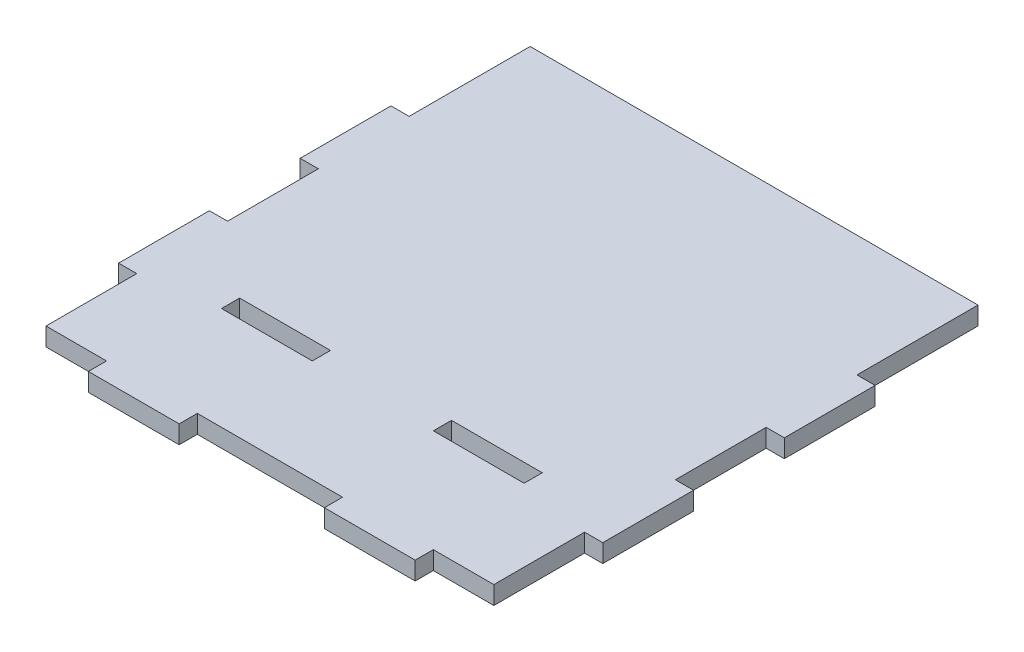
ISO-10303-21;
HEADER;
FILE_DESCRIPTION(('STEP AP214'),'2;1');
FILE_NAME('part.step','',(''),(''),'','','');
FILE_SCHEMA(('AUTOMOTIVE_DESIGN { 1 0 10303 214 1 1 1 1 }'));
ENDSEC;
DATA;
#1=APPLICATION_CONTEXT('core data for automotive mechanical design processes');
#2=APPLICATION_PROTOCOL_DEFINITION('international standard','automotive_design',2000,#1);
#3=PRODUCT_CONTEXT('',#1,'mechanical');
#4=PRODUCT('Part','Part','',(#3));
#5=PRODUCT_RELATED_PRODUCT_CATEGORY('part','',(#4));
#6=PRODUCT_DEFINITION_FORMATION('','',#4);
#7=PRODUCT_DEFINITION_CONTEXT('part definition',#1,'design');
#8=PRODUCT_DEFINITION('design','',#6,#7);
#9=PRODUCT_DEFINITION_SHAPE('','',#8);
#10=(LENGTH_UNIT() NAMED_UNIT(*) SI_UNIT(.MILLI.,.METRE.));
#11=(NAMED_UNIT(*) PLANE_ANGLE_UNIT() SI_UNIT($,.RADIAN.));
#12=(NAMED_UNIT(*) SI_UNIT($,.STERADIAN.) SOLID_ANGLE_UNIT());
#13=UNCERTAINTY_MEASURE_WITH_UNIT(LENGTH_MEASURE(1.E-05),#10,'distance_accuracy_value','');
#14=(GEOMETRIC_REPRESENTATION_CONTEXT(3) GLOBAL_UNCERTAINTY_ASSIGNED_CONTEXT((#13)) GLOBAL_UNIT_ASSIGNED_CONTEXT((#10,
#11,#12)) REPRESENTATION_CONTEXT('',''));
#15=CARTESIAN_POINT('',(0.,0.,0.));
#16=DIRECTION('',(0.,0.,1.));
#17=DIRECTION('',(1.,0.,0.));
#18=AXIS2_PLACEMENT_3D('',#15,#16,#17);
#19=CARTESIAN_POINT('',(-37.,3.,0.));
#20=DIRECTION('',(1.,0.,0.));
#21=DIRECTION('',(0.,0.,-1.));
#22=AXIS2_PLACEMENT_3D('',#19,#20,#21);
#23=PLANE('',#22);
#24=DIRECTION('',(0.,-1.,0.));
#25=VECTOR('',#24,1.);
#26=CARTESIAN_POINT('',(-37.,3.,-20.));
#27=LINE('',#26,#25);
#28=CARTESIAN_POINT('',(-37.,3.,-20.));
#29=VERTEX_POINT('',#28);
#30=CARTESIAN_POINT('',(-37.,0.,-20.));
#31=VERTEX_POINT('',#30);
#32=EDGE_CURVE('E218',#29,#31,#27,.T.);
#33=ORIENTED_EDGE('',*,*,#32,.F.);
#34=DIRECTION('',(0.,0.,1.));
#35=VECTOR('',#34,1.);
#36=CARTESIAN_POINT('',(-37.,3.,0.));
#37=LINE('',#36,#35);
#38=CARTESIAN_POINT('',(-37.,3.,-40.));
#39=VERTEX_POINT('',#38);
#40=EDGE_CURVE('E524',#39,#29,#37,.T.);
#41=ORIENTED_EDGE('',*,*,#40,.F.);
#42=DIRECTION('',(0.,-1.,0.));
#43=VECTOR('',#42,1.);
#44=CARTESIAN_POINT('',(-37.,3.,-40.));
#45=LINE('',#44,#43);
#46=CARTESIAN_POINT('',(-37.,0.,-40.));
#47=VERTEX_POINT('',#46);
#48=EDGE_CURVE('E678',#39,#47,#45,.T.);
#49=ORIENTED_EDGE('',*,*,#48,.T.);
#50=DIRECTION('',(0.,0.,1.));
#51=VECTOR('',#50,1.);
#52=CARTESIAN_POINT('',(-37.,0.,0.));
#53=LINE('',#52,#51);
#54=EDGE_CURVE('E581',#47,#31,#53,.T.);
#55=ORIENTED_EDGE('',*,*,#54,.T.);
#56=EDGE_LOOP('',(#33,#41,#49,#55));
#57=FACE_BOUND('',#56,.T.);
#58=ADVANCED_FACE('F209',(#57),#23,.F.);
#59=CARTESIAN_POINT('',(-37.,3.,-4.99999999999999));
#60=VERTEX_POINT('',#59);
#61=CARTESIAN_POINT('',(-37.,3.,10.));
#62=VERTEX_POINT('',#61);
#63=EDGE_CURVE('E523',#60,#62,#37,.T.);
#64=ORIENTED_EDGE('',*,*,#63,.F.);
#65=DIRECTION('',(0.,-1.,0.));
#66=VECTOR('',#65,1.);
#67=CARTESIAN_POINT('',(-37.,3.,-4.99999999999999));
#68=LINE('',#67,#66);
#69=CARTESIAN_POINT('',(-37.,0.,-4.99999999999999));
#70=VERTEX_POINT('',#69);
#71=EDGE_CURVE('E12',#60,#70,#68,.T.);
#72=ORIENTED_EDGE('',*,*,#71,.T.);
#73=CARTESIAN_POINT('',(-37.,0.,10.));
#74=VERTEX_POINT('',#73);
#75=EDGE_CURVE('E580',#70,#74,#53,.T.);
#76=ORIENTED_EDGE('',*,*,#75,.T.);
#77=DIRECTION('',(0.,-1.,0.));
#78=VECTOR('',#77,1.);
#79=CARTESIAN_POINT('',(-37.,3.,10.));
#80=LINE('',#79,#78);
#81=EDGE_CURVE('E676',#62,#74,#80,.T.);
#82=ORIENTED_EDGE('',*,*,#81,.F.);
#83=EDGE_LOOP('',(#64,#72,#76,#82));
#84=FACE_BOUND('',#83,.T.);
#85=ADVANCED_FACE('F799',(#84),#23,.F.);
#86=CARTESIAN_POINT('',(-37.,0.,25.));
#87=VERTEX_POINT('',#86);
#88=CARTESIAN_POINT('',(-37.,0.,40.));
#89=VERTEX_POINT('',#88);
#90=EDGE_CURVE('E585',#87,#89,#53,.T.);
#91=ORIENTED_EDGE('',*,*,#90,.T.);
#92=DIRECTION('',(0.,-1.,0.));
#93=VECTOR('',#92,1.);
#94=CARTESIAN_POINT('',(-37.,3.,40.));
#95=LINE('',#94,#93);
#96=CARTESIAN_POINT('',(-37.,3.,40.));
#97=VERTEX_POINT('',#96);
#98=EDGE_CURVE('E666',#97,#89,#95,.T.);
#99=ORIENTED_EDGE('',*,*,#98,.F.);
#100=CARTESIAN_POINT('',(-37.,3.,25.));
#101=VERTEX_POINT('',#100);
#102=EDGE_CURVE('E528',#101,#97,#37,.T.);
#103=ORIENTED_EDGE('',*,*,#102,.F.);
#104=DIRECTION('',(0.,-1.,0.));
#105=VECTOR('',#104,1.);
#106=CARTESIAN_POINT('',(-37.,3.,25.));
#107=LINE('',#106,#105);
#108=EDGE_CURVE('E669',#101,#87,#107,.T.);
#109=ORIENTED_EDGE('',*,*,#108,.T.);
#110=EDGE_LOOP('',(#91,#99,#103,#109));
#111=FACE_BOUND('',#110,.T.);
#112=ADVANCED_FACE('F795',(#111),#23,.F.);
#113=CARTESIAN_POINT('',(0.,3.,40.));
#114=DIRECTION('',(0.,0.,-1.));
#115=DIRECTION('',(-1.,0.,0.));
#116=AXIS2_PLACEMENT_3D('',#113,#114,#115);
#117=PLANE('',#116);
#118=DIRECTION('',(1.,0.,0.));
#119=VECTOR('',#118,1.);
#120=CARTESIAN_POINT('',(0.,0.,40.));
#121=LINE('',#120,#119);
#122=CARTESIAN_POINT('',(27.,0.,40.));
#123=VERTEX_POINT('',#122);
#124=CARTESIAN_POINT('',(37.,0.,40.));
#125=VERTEX_POINT('',#124);
#126=EDGE_CURVE('E597',#123,#125,#121,.T.);
#127=ORIENTED_EDGE('',*,*,#126,.T.);
#128=DIRECTION('',(0.,-1.,0.));
#129=VECTOR('',#128,1.);
#130=CARTESIAN_POINT('',(37.,3.,40.));
#131=LINE('',#130,#129);
#132=CARTESIAN_POINT('',(37.,3.,40.));
#133=VERTEX_POINT('',#132);
#134=EDGE_CURVE('E647',#133,#125,#131,.T.);
#135=ORIENTED_EDGE('',*,*,#134,.F.);
#136=DIRECTION('',(1.,0.,0.));
#137=VECTOR('',#136,1.);
#138=CARTESIAN_POINT('',(0.,3.,40.));
#139=LINE('',#138,#137);
#140=CARTESIAN_POINT('',(27.,3.,40.));
#141=VERTEX_POINT('',#140);
#142=EDGE_CURVE('E539',#141,#133,#139,.T.);
#143=ORIENTED_EDGE('',*,*,#142,.F.);
#144=DIRECTION('',(0.,-1.,0.));
#145=VECTOR('',#144,1.);
#146=CARTESIAN_POINT('',(27.,3.,40.));
#147=LINE('',#146,#145);
#148=EDGE_CURVE('E649',#141,#123,#147,.T.);
#149=ORIENTED_EDGE('',*,*,#148,.T.);
#150=EDGE_LOOP('',(#127,#135,#143,#149));
#151=FACE_BOUND('',#150,.T.);
#152=ADVANCED_FACE('F779',(#151),#117,.F.);
#153=CARTESIAN_POINT('',(-12.,0.,40.));
#154=VERTEX_POINT('',#153);
#155=CARTESIAN_POINT('',(12.,0.,40.));
#156=VERTEX_POINT('',#155);
#157=EDGE_CURVE('E598',#154,#156,#121,.T.);
#158=ORIENTED_EDGE('',*,*,#157,.T.);
#159=DIRECTION('',(0.,-1.,0.));
#160=VECTOR('',#159,1.);
#161=CARTESIAN_POINT('',(12.,3.,40.));
#162=LINE('',#161,#160);
#163=CARTESIAN_POINT('',(12.,3.,40.));
#164=VERTEX_POINT('',#163);
#165=EDGE_CURVE('E655',#164,#156,#162,.T.);
#166=ORIENTED_EDGE('',*,*,#165,.F.);
#167=CARTESIAN_POINT('',(-12.,3.,40.));
#168=VERTEX_POINT('',#167);
#169=EDGE_CURVE('E540',#168,#164,#139,.T.);
#170=ORIENTED_EDGE('',*,*,#169,.F.);
#171=DIRECTION('',(0.,-1.,0.));
#172=VECTOR('',#171,1.);
#173=CARTESIAN_POINT('',(-12.,3.,40.));
#174=LINE('',#173,#172);
#175=EDGE_CURVE('E657',#168,#154,#174,.T.);
#176=ORIENTED_EDGE('',*,*,#175,.T.);
#177=EDGE_LOOP('',(#158,#166,#170,#176));
#178=FACE_BOUND('',#177,.T.);
#179=ADVANCED_FACE('F748',(#178),#117,.F.);
#180=CARTESIAN_POINT('',(-27.,0.,40.));
#181=VERTEX_POINT('',#180);
#182=EDGE_CURVE('E593',#89,#181,#121,.T.);
#183=ORIENTED_EDGE('',*,*,#182,.T.);
#184=DIRECTION('',(0.,-1.,0.));
#185=VECTOR('',#184,1.);
#186=CARTESIAN_POINT('',(-27.,3.,40.));
#187=LINE('',#186,#185);
#188=CARTESIAN_POINT('',(-27.,3.,40.));
#189=VERTEX_POINT('',#188);
#190=EDGE_CURVE('E664',#189,#181,#187,.T.);
#191=ORIENTED_EDGE('',*,*,#190,.F.);
#192=EDGE_CURVE('E535',#97,#189,#139,.T.);
#193=ORIENTED_EDGE('',*,*,#192,.F.);
#194=ORIENTED_EDGE('',*,*,#98,.T.);
#195=EDGE_LOOP('',(#183,#191,#193,#194));
#196=FACE_BOUND('',#195,.T.);
#197=ADVANCED_FACE('F797',(#196),#117,.F.);
#198=CARTESIAN_POINT('',(37.,3.,0.));
#199=DIRECTION('',(1.,0.,0.));
#200=DIRECTION('',(0.,0.,-1.));
#201=AXIS2_PLACEMENT_3D('',#198,#199,#200);
#202=PLANE('',#201);
#203=DIRECTION('',(0.,0.,1.));
#204=VECTOR('',#203,1.);
#205=CARTESIAN_POINT('',(37.,0.,0.));
#206=LINE('',#205,#204);
#207=CARTESIAN_POINT('',(37.,0.,25.));
#208=VERTEX_POINT('',#207);
#209=EDGE_CURVE('E577',#208,#125,#206,.T.);
#210=ORIENTED_EDGE('',*,*,#209,.F.);
#211=DIRECTION('',(0.,-1.,0.));
#212=VECTOR('',#211,1.);
#213=CARTESIAN_POINT('',(37.,3.,25.));
#214=LINE('',#213,#212);
#215=CARTESIAN_POINT('',(37.,3.,25.));
#216=VERTEX_POINT('',#215);
#217=EDGE_CURVE('E645',#216,#208,#214,.T.);
#218=ORIENTED_EDGE('',*,*,#217,.F.);
#219=DIRECTION('',(0.,0.,1.));
#220=VECTOR('',#219,1.);
#221=CARTESIAN_POINT('',(37.,3.,0.));
#222=LINE('',#221,#220);
#223=EDGE_CURVE('E520',#216,#133,#222,.T.);
#224=ORIENTED_EDGE('',*,*,#223,.T.);
#225=ORIENTED_EDGE('',*,*,#134,.T.);
#226=EDGE_LOOP('',(#210,#218,#224,#225));
#227=FACE_BOUND('',#226,.T.);
#228=ADVANCED_FACE('F778',(#227),#202,.T.);
#229=CARTESIAN_POINT('',(37.,0.,-4.99999999999999));
#230=VERTEX_POINT('',#229);
#231=CARTESIAN_POINT('',(37.,0.,10.));
#232=VERTEX_POINT('',#231);
#233=EDGE_CURVE('E576',#230,#232,#206,.T.);
#234=ORIENTED_EDGE('',*,*,#233,.F.);
#235=DIRECTION('',(0.,-1.,0.));
#236=VECTOR('',#235,1.);
#237=CARTESIAN_POINT('',(37.,3.,-4.99999999999999));
#238=LINE('',#237,#236);
#239=CARTESIAN_POINT('',(37.,3.,-4.99999999999999));
#240=VERTEX_POINT('',#239);
#241=EDGE_CURVE('E637',#240,#230,#238,.T.);
#242=ORIENTED_EDGE('',*,*,#241,.F.);
#243=CARTESIAN_POINT('',(37.,3.,10.));
#244=VERTEX_POINT('',#243);
#245=EDGE_CURVE('E519',#240,#244,#222,.T.);
#246=ORIENTED_EDGE('',*,*,#245,.T.);
#247=DIRECTION('',(0.,-1.,0.));
#248=VECTOR('',#247,1.);
#249=CARTESIAN_POINT('',(37.,3.,10.));
#250=LINE('',#249,#248);
#251=EDGE_CURVE('E639',#244,#232,#250,.T.);
#252=ORIENTED_EDGE('',*,*,#251,.T.);
#253=EDGE_LOOP('',(#234,#242,#246,#252));
#254=FACE_BOUND('',#253,.T.);
#255=ADVANCED_FACE('F734',(#254),#202,.T.);
#256=CARTESIAN_POINT('',(37.,0.,-40.));
#257=VERTEX_POINT('',#256);
#258=CARTESIAN_POINT('',(37.,0.,-20.));
#259=VERTEX_POINT('',#258);
#260=EDGE_CURVE('E572',#257,#259,#206,.T.);
#261=ORIENTED_EDGE('',*,*,#260,.F.);
#262=DIRECTION('',(0.,-1.,0.));
#263=VECTOR('',#262,1.);
#264=CARTESIAN_POINT('',(37.,3.,-40.));
#265=LINE('',#264,#263);
#266=CARTESIAN_POINT('',(37.,3.,-40.));
#267=VERTEX_POINT('',#266);
#268=EDGE_CURVE('E680',#267,#257,#265,.T.);
#269=ORIENTED_EDGE('',*,*,#268,.F.);
#270=CARTESIAN_POINT('',(37.,3.,-20.));
#271=VERTEX_POINT('',#270);
#272=EDGE_CURVE('E514',#267,#271,#222,.T.);
#273=ORIENTED_EDGE('',*,*,#272,.T.);
#274=DIRECTION('',(0.,-1.,0.));
#275=VECTOR('',#274,1.);
#276=CARTESIAN_POINT('',(37.,3.,-20.));
#277=LINE('',#276,#275);
#278=EDGE_CURVE('E571',#271,#259,#277,.T.);
#279=ORIENTED_EDGE('',*,*,#278,.T.);
#280=EDGE_LOOP('',(#261,#269,#273,#279));
#281=FACE_BOUND('',#280,.T.);
#282=ADVANCED_FACE('F829',(#281),#202,.T.);
#283=CARTESIAN_POINT('',(0.,3.,-40.));
#284=DIRECTION('',(0.,0.,-1.));
#285=DIRECTION('',(-1.,0.,0.));
#286=AXIS2_PLACEMENT_3D('',#283,#284,#285);
#287=PLANE('',#286);
#288=DIRECTION('',(1.,0.,0.));
#289=VECTOR('',#288,1.);
#290=CARTESIAN_POINT('',(0.,0.,-40.));
#291=LINE('',#290,#289);
#292=EDGE_CURVE('E575',#47,#257,#291,.T.);
#293=ORIENTED_EDGE('',*,*,#292,.F.);
#294=ORIENTED_EDGE('',*,*,#48,.F.);
#295=DIRECTION('',(1.,0.,0.));
#296=VECTOR('',#295,1.);
#297=CARTESIAN_POINT('',(0.,3.,-40.));
#298=LINE('',#297,#296);
#299=EDGE_CURVE('E517',#39,#267,#298,.T.);
#300=ORIENTED_EDGE('',*,*,#299,.T.);
#301=ORIENTED_EDGE('',*,*,#268,.T.);
#302=EDGE_LOOP('',(#293,#294,#300,#301));
#303=FACE_BOUND('',#302,.T.);
#304=ADVANCED_FACE('F717',(#303),#287,.T.);
#305=CARTESIAN_POINT('',(0.,3.,10.));
#306=DIRECTION('',(0.,0.,1.));
#307=DIRECTION('',(1.,0.,0.));
#308=AXIS2_PLACEMENT_3D('',#305,#306,#307);
#309=PLANE('',#308);
#310=DIRECTION('',(-1.,0.,0.));
#311=VECTOR('',#310,1.);
#312=CARTESIAN_POINT('',(0.,0.,10.));
#313=LINE('',#312,#311);
#314=CARTESIAN_POINT('',(-40.,0.,10.));
#315=VERTEX_POINT('',#314);
#316=EDGE_CURVE('E584',#74,#315,#313,.T.);
#317=ORIENTED_EDGE('',*,*,#316,.T.);
#318=DIRECTION('',(0.,-1.,0.));
#319=VECTOR('',#318,1.);
#320=CARTESIAN_POINT('',(-40.,3.,10.));
#321=LINE('',#320,#319);
#322=CARTESIAN_POINT('',(-40.,3.,10.));
#323=VERTEX_POINT('',#322);
#324=EDGE_CURVE('E673',#323,#315,#321,.T.);
#325=ORIENTED_EDGE('',*,*,#324,.F.);
#326=DIRECTION('',(-1.,0.,0.));
#327=VECTOR('',#326,1.);
#328=CARTESIAN_POINT('',(0.,3.,10.));
#329=LINE('',#328,#327);
#330=EDGE_CURVE('E527',#62,#323,#329,.T.);
#331=ORIENTED_EDGE('',*,*,#330,.F.);
#332=ORIENTED_EDGE('',*,*,#81,.T.);
#333=EDGE_LOOP('',(#317,#325,#331,#332));
#334=FACE_BOUND('',#333,.T.);
#335=ADVANCED_FACE('F805',(#334),#309,.F.);
#336=CARTESIAN_POINT('',(-40.,3.,0.));
#337=DIRECTION('',(1.,0.,0.));
#338=DIRECTION('',(0.,0.,-1.));
#339=AXIS2_PLACEMENT_3D('',#336,#337,#338);
#340=PLANE('',#339);
#341=DIRECTION('',(0.,0.,1.));
#342=VECTOR('',#341,1.);
#343=CARTESIAN_POINT('',(-40.,0.,0.));
#344=LINE('',#343,#342);
#345=CARTESIAN_POINT('',(-40.,0.,25.));
#346=VERTEX_POINT('',#345);
#347=EDGE_CURVE('E587',#315,#346,#344,.T.);
#348=ORIENTED_EDGE('',*,*,#347,.T.);
#349=DIRECTION('',(0.,-1.,0.));
#350=VECTOR('',#349,1.);
#351=CARTESIAN_POINT('',(-40.,3.,25.));
#352=LINE('',#351,#350);
#353=CARTESIAN_POINT('',(-40.,3.,25.));
#354=VERTEX_POINT('',#353);
#355=EDGE_CURVE('E671',#354,#346,#352,.T.);
#356=ORIENTED_EDGE('',*,*,#355,.F.);
#357=DIRECTION('',(0.,0.,1.));
#358=VECTOR('',#357,1.);
#359=CARTESIAN_POINT('',(-40.,3.,0.));
#360=LINE('',#359,#358);
#361=EDGE_CURVE('E530',#323,#354,#360,.T.);
#362=ORIENTED_EDGE('',*,*,#361,.F.);
#363=ORIENTED_EDGE('',*,*,#324,.T.);
#364=EDGE_LOOP('',(#348,#356,#362,#363));
#365=FACE_BOUND('',#364,.T.);
#366=ADVANCED_FACE('F815',(#365),#340,.F.);
#367=CARTESIAN_POINT('',(0.,3.,25.));
#368=DIRECTION('',(0.,0.,1.));
#369=DIRECTION('',(1.,0.,0.));
#370=AXIS2_PLACEMENT_3D('',#367,#368,#369);
#371=PLANE('',#370);
#372=DIRECTION('',(-1.,0.,0.));
#373=VECTOR('',#372,1.);
#374=CARTESIAN_POINT('',(0.,0.,25.));
#375=LINE('',#374,#373);
#376=EDGE_CURVE('E590',#87,#346,#375,.T.);
#377=ORIENTED_EDGE('',*,*,#376,.F.);
#378=ORIENTED_EDGE('',*,*,#108,.F.);
#379=DIRECTION('',(-1.,0.,0.));
#380=VECTOR('',#379,1.);
#381=CARTESIAN_POINT('',(0.,3.,25.));
#382=LINE('',#381,#380);
#383=EDGE_CURVE('E532',#101,#354,#382,.T.);
#384=ORIENTED_EDGE('',*,*,#383,.T.);
#385=ORIENTED_EDGE('',*,*,#355,.T.);
#386=EDGE_LOOP('',(#377,#378,#384,#385));
#387=FACE_BOUND('',#386,.T.);
#388=ADVANCED_FACE('F810',(#387),#371,.T.);
#389=CARTESIAN_POINT('',(-40.,3.,-20.));
#390=DIRECTION('',(1.,0.,0.));
#391=DIRECTION('',(0.,0.,-1.));
#392=AXIS2_PLACEMENT_3D('',#389,#390,#391);
#393=PLANE('',#392);
#394=DIRECTION('',(0.,0.,1.));
#395=VECTOR('',#394,1.);
#396=CARTESIAN_POINT('',(-40.,0.,-20.));
#397=LINE('',#396,#395);
#398=CARTESIAN_POINT('',(-40.,0.,-20.));
#399=VERTEX_POINT('',#398);
#400=CARTESIAN_POINT('',(-40.,0.,-4.99999999999999));
#401=VERTEX_POINT('',#400);
#402=EDGE_CURVE('E694',#399,#401,#397,.T.);
#403=ORIENTED_EDGE('',*,*,#402,.T.);
#404=DIRECTION('',(0.,-1.,0.));
#405=VECTOR('',#404,1.);
#406=CARTESIAN_POINT('',(-40.,3.,-4.99999999999999));
#407=LINE('',#406,#405);
#408=CARTESIAN_POINT('',(-40.,3.,-4.99999999999999));
#409=VERTEX_POINT('',#408);
#410=EDGE_CURVE('E691',#409,#401,#407,.T.);
#411=ORIENTED_EDGE('',*,*,#410,.F.);
#412=DIRECTION('',(0.,0.,1.));
#413=VECTOR('',#412,1.);
#414=CARTESIAN_POINT('',(-40.,3.,-20.));
#415=LINE('',#414,#413);
#416=CARTESIAN_POINT('',(-40.,3.,-20.));
#417=VERTEX_POINT('',#416);
#418=EDGE_CURVE('E685',#417,#409,#415,.T.);
#419=ORIENTED_EDGE('',*,*,#418,.F.);
#420=DIRECTION('',(0.,-1.,0.));
#421=VECTOR('',#420,1.);
#422=CARTESIAN_POINT('',(-40.,3.,-20.));
#423=LINE('',#422,#421);
#424=EDGE_CURVE('E213',#417,#399,#423,.T.);
#425=ORIENTED_EDGE('',*,*,#424,.T.);
#426=EDGE_LOOP('',(#403,#411,#419,#425));
#427=FACE_BOUND('',#426,.T.);
#428=ADVANCED_FACE('F705',(#427),#393,.F.);
#429=CARTESIAN_POINT('',(-37.,3.,-4.99999999999999));
#430=DIRECTION('',(0.,0.,1.));
#431=DIRECTION('',(1.,0.,0.));
#432=AXIS2_PLACEMENT_3D('',#429,#430,#431);
#433=PLANE('',#432);
#434=DIRECTION('',(-1.,0.,0.));
#435=VECTOR('',#434,1.);
#436=CARTESIAN_POINT('',(-37.,0.,-4.99999999999999));
#437=LINE('',#436,#435);
#438=EDGE_CURVE('E686',#70,#401,#437,.T.);
#439=ORIENTED_EDGE('',*,*,#438,.F.);
#440=ORIENTED_EDGE('',*,*,#71,.F.);
#441=DIRECTION('',(-1.,0.,0.));
#442=VECTOR('',#441,1.);
#443=CARTESIAN_POINT('',(-37.,3.,-4.99999999999999));
#444=LINE('',#443,#442);
#445=EDGE_CURVE('E688',#60,#409,#444,.T.);
#446=ORIENTED_EDGE('',*,*,#445,.T.);
#447=ORIENTED_EDGE('',*,*,#410,.T.);
#448=EDGE_LOOP('',(#439,#440,#446,#447));
#449=FACE_BOUND('',#448,.T.);
#450=ADVANCED_FACE('F792',(#449),#433,.T.);
#451=CARTESIAN_POINT('',(-37.,3.,-20.));
#452=DIRECTION('',(0.,0.,1.));
#453=DIRECTION('',(1.,0.,0.));
#454=AXIS2_PLACEMENT_3D('',#451,#452,#453);
#455=PLANE('',#454);
#456=DIRECTION('',(-1.,0.,0.));
#457=VECTOR('',#456,1.);
#458=CARTESIAN_POINT('',(-37.,0.,-20.));
#459=LINE('',#458,#457);
#460=EDGE_CURVE('E481',#31,#399,#459,.T.);
#461=ORIENTED_EDGE('',*,*,#460,.T.);
#462=ORIENTED_EDGE('',*,*,#424,.F.);
#463=DIRECTION('',(-1.,0.,0.));
#464=VECTOR('',#463,1.);
#465=CARTESIAN_POINT('',(-37.,3.,-20.));
#466=LINE('',#465,#464);
#467=EDGE_CURVE('E682',#29,#417,#466,.T.);
#468=ORIENTED_EDGE('',*,*,#467,.F.);
#469=ORIENTED_EDGE('',*,*,#32,.T.);
#470=EDGE_LOOP('',(#461,#462,#468,#469));
#471=FACE_BOUND('',#470,.T.);
#472=ADVANCED_FACE('F211',(#471),#455,.F.);
#473=CARTESIAN_POINT('',(0.,3.,43.));
#474=DIRECTION('',(0.,0.,1.));
#475=DIRECTION('',(1.,0.,0.));
#476=AXIS2_PLACEMENT_3D('',#473,#474,#475);
#477=PLANE('',#476);
#478=DIRECTION('',(-1.,0.,0.));
#479=VECTOR('',#478,1.);
#480=CARTESIAN_POINT('',(0.,0.,43.));
#481=LINE('',#480,#479);
#482=CARTESIAN_POINT('',(27.,0.,43.));
#483=VERTEX_POINT('',#482);
#484=CARTESIAN_POINT('',(12.,0.,43.));
#485=VERTEX_POINT('',#484);
#486=EDGE_CURVE('E609',#483,#485,#481,.T.);
#487=ORIENTED_EDGE('',*,*,#486,.F.);
#488=DIRECTION('',(0.,-1.,0.));
#489=VECTOR('',#488,1.);
#490=CARTESIAN_POINT('',(27.,3.,43.));
#491=LINE('',#490,#489);
#492=CARTESIAN_POINT('',(27.,3.,43.));
#493=VERTEX_POINT('',#492);
#494=EDGE_CURVE('E651',#493,#483,#491,.T.);
#495=ORIENTED_EDGE('',*,*,#494,.F.);
#496=DIRECTION('',(-1.,0.,0.));
#497=VECTOR('',#496,1.);
#498=CARTESIAN_POINT('',(0.,3.,43.));
#499=LINE('',#498,#497);
#500=CARTESIAN_POINT('',(12.,3.,43.));
#501=VERTEX_POINT('',#500);
#502=EDGE_CURVE('E549',#493,#501,#499,.T.);
#503=ORIENTED_EDGE('',*,*,#502,.T.);
#504=DIRECTION('',(0.,-1.,0.));
#505=VECTOR('',#504,1.);
#506=CARTESIAN_POINT('',(12.,3.,43.));
#507=LINE('',#506,#505);
#508=EDGE_CURVE('E653',#501,#485,#507,.T.);
#509=ORIENTED_EDGE('',*,*,#508,.T.);
#510=EDGE_LOOP('',(#487,#495,#503,#509));
#511=FACE_BOUND('',#510,.T.);
#512=ADVANCED_FACE('F784',(#511),#477,.T.);
#513=CARTESIAN_POINT('',(27.,3.,0.));
#514=DIRECTION('',(1.,0.,0.));
#515=DIRECTION('',(0.,0.,-1.));
#516=AXIS2_PLACEMENT_3D('',#513,#514,#515);
#517=PLANE('',#516);
#518=DIRECTION('',(0.,0.,1.));
#519=VECTOR('',#518,1.);
#520=CARTESIAN_POINT('',(27.,0.,0.));
#521=LINE('',#520,#519);
#522=EDGE_CURVE('E612',#123,#483,#521,.T.);
#523=ORIENTED_EDGE('',*,*,#522,.F.);
#524=ORIENTED_EDGE('',*,*,#148,.F.);
#525=DIRECTION('',(0.,0.,1.));
#526=VECTOR('',#525,1.);
#527=CARTESIAN_POINT('',(27.,3.,0.));
#528=LINE('',#527,#526);
#529=EDGE_CURVE('E552',#141,#493,#528,.T.);
#530=ORIENTED_EDGE('',*,*,#529,.T.);
#531=ORIENTED_EDGE('',*,*,#494,.T.);
#532=EDGE_LOOP('',(#523,#524,#530,#531));
#533=FACE_BOUND('',#532,.T.);
#534=ADVANCED_FACE('F782',(#533),#517,.T.);
#535=CARTESIAN_POINT('',(12.,3.,0.));
#536=DIRECTION('',(1.,0.,0.));
#537=DIRECTION('',(0.,0.,-1.));
#538=AXIS2_PLACEMENT_3D('',#535,#536,#537);
#539=PLANE('',#538);
#540=DIRECTION('',(0.,0.,1.));
#541=VECTOR('',#540,1.);
#542=CARTESIAN_POINT('',(12.,0.,0.));
#543=LINE('',#542,#541);
#544=EDGE_CURVE('E606',#156,#485,#543,.T.);
#545=ORIENTED_EDGE('',*,*,#544,.T.);
#546=ORIENTED_EDGE('',*,*,#508,.F.);
#547=DIRECTION('',(0.,0.,1.));
#548=VECTOR('',#547,1.);
#549=CARTESIAN_POINT('',(12.,3.,0.));
#550=LINE('',#549,#548);
#551=EDGE_CURVE('E547',#164,#501,#550,.T.);
#552=ORIENTED_EDGE('',*,*,#551,.F.);
#553=ORIENTED_EDGE('',*,*,#165,.T.);
#554=EDGE_LOOP('',(#545,#546,#552,#553));
#555=FACE_BOUND('',#554,.T.);
#556=ADVANCED_FACE('F755',(#555),#539,.F.);
#557=CARTESIAN_POINT('',(0.,0.,0.));
#558=DIRECTION('',(0.,1.,0.));
#559=DIRECTION('',(0.,0.,1.));
#560=AXIS2_PLACEMENT_3D('',#557,#558,#559);
#561=PLANE('',#560);
#562=DIRECTION('',(-1.,0.,0.));
#563=VECTOR('',#562,1.);
#564=CARTESIAN_POINT('',(-25.,0.,20.));
#565=LINE('',#564,#563);
#566=CARTESIAN_POINT('',(-10.,0.,20.));
#567=VERTEX_POINT('',#566);
#568=CARTESIAN_POINT('',(-25.,0.,20.));
#569=VERTEX_POINT('',#568);
#570=EDGE_CURVE('E455',#567,#569,#565,.T.);
#571=ORIENTED_EDGE('',*,*,#570,.T.);
#572=DIRECTION('',(0.,0.,1.));
#573=VECTOR('',#572,1.);
#574=CARTESIAN_POINT('',(-25.,0.,20.));
#575=LINE('',#574,#573);
#576=CARTESIAN_POINT('',(-25.,0.,23.));
#577=VERTEX_POINT('',#576);
#578=EDGE_CURVE('E447',#569,#577,#575,.T.);
#579=ORIENTED_EDGE('',*,*,#578,.T.);
#580=DIRECTION('',(1.,0.,0.));
#581=VECTOR('',#580,1.);
#582=CARTESIAN_POINT('',(-25.,0.,23.));
#583=LINE('',#582,#581);
#584=CARTESIAN_POINT('',(-10.,0.,23.));
#585=VERTEX_POINT('',#584);
#586=EDGE_CURVE('E458',#577,#585,#583,.T.);
#587=ORIENTED_EDGE('',*,*,#586,.T.);
#588=DIRECTION('',(0.,0.,-1.));
#589=VECTOR('',#588,1.);
#590=CARTESIAN_POINT('',(-10.,0.,20.));
#591=LINE('',#590,#589);
#592=EDGE_CURVE('E226',#585,#567,#591,.T.);
#593=ORIENTED_EDGE('',*,*,#592,.T.);
#594=EDGE_LOOP('',(#571,#579,#587,#593));
#595=FACE_BOUND('',#594,.T.);
#596=DIRECTION('',(1.,0.,0.));
#597=VECTOR('',#596,1.);
#598=CARTESIAN_POINT('',(25.,0.,23.));
#599=LINE('',#598,#597);
#600=CARTESIAN_POINT('',(10.,0.,23.));
#601=VERTEX_POINT('',#600);
#602=CARTESIAN_POINT('',(25.,0.,23.));
#603=VERTEX_POINT('',#602);
#604=EDGE_CURVE('E488',#601,#603,#599,.T.);
#605=ORIENTED_EDGE('',*,*,#604,.T.);
#606=DIRECTION('',(0.,0.,-1.));
#607=VECTOR('',#606,1.);
#608=CARTESIAN_POINT('',(25.,0.,20.));
#609=LINE('',#608,#607);
#610=CARTESIAN_POINT('',(25.,0.,20.));
#611=VERTEX_POINT('',#610);
#612=EDGE_CURVE('E499',#603,#611,#609,.T.);
#613=ORIENTED_EDGE('',*,*,#612,.T.);
#614=DIRECTION('',(-1.,0.,0.));
#615=VECTOR('',#614,1.);
#616=CARTESIAN_POINT('',(25.,0.,20.));
#617=LINE('',#616,#615);
#618=CARTESIAN_POINT('',(10.,0.,20.));
#619=VERTEX_POINT('',#618);
#620=EDGE_CURVE('E509',#611,#619,#617,.T.);
#621=ORIENTED_EDGE('',*,*,#620,.T.);
#622=DIRECTION('',(0.,0.,1.));
#623=VECTOR('',#622,1.);
#624=CARTESIAN_POINT('',(10.,0.,20.));
#625=LINE('',#624,#623);
#626=EDGE_CURVE('E234',#619,#601,#625,.T.);
#627=ORIENTED_EDGE('',*,*,#626,.T.);
#628=EDGE_LOOP('',(#605,#613,#621,#627));
#629=FACE_BOUND('',#628,.T.);
#630=ORIENTED_EDGE('',*,*,#544,.F.);
#631=ORIENTED_EDGE('',*,*,#157,.F.);
#632=DIRECTION('',(0.,0.,1.));
#633=VECTOR('',#632,1.);
#634=CARTESIAN_POINT('',(-12.,0.,0.));
#635=LINE('',#634,#633);
#636=CARTESIAN_POINT('',(-12.,0.,43.));
#637=VERTEX_POINT('',#636);
#638=EDGE_CURVE('E603',#154,#637,#635,.T.);
#639=ORIENTED_EDGE('',*,*,#638,.T.);
#640=DIRECTION('',(1.,0.,0.));
#641=VECTOR('',#640,1.);
#642=CARTESIAN_POINT('',(0.,0.,43.));
#643=LINE('',#642,#641);
#644=CARTESIAN_POINT('',(-27.,0.,43.));
#645=VERTEX_POINT('',#644);
#646=EDGE_CURVE('E600',#645,#637,#643,.T.);
#647=ORIENTED_EDGE('',*,*,#646,.F.);
#648=DIRECTION('',(0.,0.,1.));
#649=VECTOR('',#648,1.);
#650=CARTESIAN_POINT('',(-27.,0.,0.));
#651=LINE('',#650,#649);
#652=EDGE_CURVE('E596',#181,#645,#651,.T.);
#653=ORIENTED_EDGE('',*,*,#652,.F.);
#654=ORIENTED_EDGE('',*,*,#182,.F.);
#655=ORIENTED_EDGE('',*,*,#90,.F.);
#656=ORIENTED_EDGE('',*,*,#376,.T.);
#657=ORIENTED_EDGE('',*,*,#347,.F.);
#658=ORIENTED_EDGE('',*,*,#316,.F.);
#659=ORIENTED_EDGE('',*,*,#75,.F.);
#660=ORIENTED_EDGE('',*,*,#438,.T.);
#661=ORIENTED_EDGE('',*,*,#402,.F.);
#662=ORIENTED_EDGE('',*,*,#460,.F.);
#663=ORIENTED_EDGE('',*,*,#54,.F.);
#664=ORIENTED_EDGE('',*,*,#292,.T.);
#665=ORIENTED_EDGE('',*,*,#260,.T.);
#666=DIRECTION('',(1.,0.,0.));
#667=VECTOR('',#666,1.);
#668=CARTESIAN_POINT('',(0.,0.,-20.));
#669=LINE('',#668,#667);
#670=CARTESIAN_POINT('',(40.,0.,-20.));
#671=VERTEX_POINT('',#670);
#672=EDGE_CURVE('E518',#259,#671,#669,.T.);
#673=ORIENTED_EDGE('',*,*,#672,.T.);
#674=DIRECTION('',(0.,0.,1.));
#675=VECTOR('',#674,1.);
#676=CARTESIAN_POINT('',(40.,0.,0.));
#677=LINE('',#676,#675);
#678=CARTESIAN_POINT('',(40.,0.,-4.99999999999999));
#679=VERTEX_POINT('',#678);
#680=EDGE_CURVE('E627',#671,#679,#677,.T.);
#681=ORIENTED_EDGE('',*,*,#680,.T.);
#682=DIRECTION('',(1.,0.,0.));
#683=VECTOR('',#682,1.);
#684=CARTESIAN_POINT('',(0.,0.,-4.99999999999998));
#685=LINE('',#684,#683);
#686=EDGE_CURVE('E624',#230,#679,#685,.T.);
#687=ORIENTED_EDGE('',*,*,#686,.F.);
#688=ORIENTED_EDGE('',*,*,#233,.T.);
#689=DIRECTION('',(1.,0.,0.));
#690=VECTOR('',#689,1.);
#691=CARTESIAN_POINT('',(0.,0.,10.));
#692=LINE('',#691,#690);
#693=CARTESIAN_POINT('',(40.,0.,10.));
#694=VERTEX_POINT('',#693);
#695=EDGE_CURVE('E621',#232,#694,#692,.T.);
#696=ORIENTED_EDGE('',*,*,#695,.T.);
#697=DIRECTION('',(0.,0.,1.));
#698=VECTOR('',#697,1.);
#699=CARTESIAN_POINT('',(40.,0.,0.));
#700=LINE('',#699,#698);
#701=CARTESIAN_POINT('',(40.,0.,25.));
#702=VERTEX_POINT('',#701);
#703=EDGE_CURVE('E618',#694,#702,#700,.T.);
#704=ORIENTED_EDGE('',*,*,#703,.T.);
#705=DIRECTION('',(1.,0.,0.));
#706=VECTOR('',#705,1.);
#707=CARTESIAN_POINT('',(0.,0.,25.));
#708=LINE('',#707,#706);
#709=EDGE_CURVE('E615',#208,#702,#708,.T.);
#710=ORIENTED_EDGE('',*,*,#709,.F.);
#711=ORIENTED_EDGE('',*,*,#209,.T.);
#712=ORIENTED_EDGE('',*,*,#126,.F.);
#713=ORIENTED_EDGE('',*,*,#522,.T.);
#714=ORIENTED_EDGE('',*,*,#486,.T.);
#715=EDGE_LOOP('',(#630,#631,#639,#647,#653,#654,#655,#656,#657,#658,#659,#660,#661,#662,#663,
#664,#665,#673,#681,#687,#688,#696,#704,#710,#711,#712,#713,#714));
#716=FACE_BOUND('',#715,.T.);
#717=ADVANCED_FACE('F462',(#595,#629,#716),#561,.F.);
#718=CARTESIAN_POINT('',(0.,3.,0.));
#719=DIRECTION('',(0.,1.,0.));
#720=DIRECTION('',(0.,0.,1.));
#721=AXIS2_PLACEMENT_3D('',#718,#719,#720);
#722=PLANE('',#721);
#723=DIRECTION('',(0.,0.,1.));
#724=VECTOR('',#723,1.);
#725=CARTESIAN_POINT('',(-25.,3.,20.));
#726=LINE('',#725,#724);
#727=CARTESIAN_POINT('',(-25.,3.,20.));
#728=VERTEX_POINT('',#727);
#729=CARTESIAN_POINT('',(-25.,3.,23.));
#730=VERTEX_POINT('',#729);
#731=EDGE_CURVE('E450',#728,#730,#726,.T.);
#732=ORIENTED_EDGE('',*,*,#731,.F.);
#733=DIRECTION('',(-1.,0.,0.));
#734=VECTOR('',#733,1.);
#735=CARTESIAN_POINT('',(-25.,3.,20.));
#736=LINE('',#735,#734);
#737=CARTESIAN_POINT('',(-10.,3.,20.));
#738=VERTEX_POINT('',#737);
#739=EDGE_CURVE('E465',#738,#728,#736,.T.);
#740=ORIENTED_EDGE('',*,*,#739,.F.);
#741=DIRECTION('',(0.,0.,-1.));
#742=VECTOR('',#741,1.);
#743=CARTESIAN_POINT('',(-10.,3.,20.));
#744=LINE('',#743,#742);
#745=CARTESIAN_POINT('',(-10.,3.,23.));
#746=VERTEX_POINT('',#745);
#747=EDGE_CURVE('E468',#746,#738,#744,.T.);
#748=ORIENTED_EDGE('',*,*,#747,.F.);
#749=DIRECTION('',(1.,0.,0.));
#750=VECTOR('',#749,1.);
#751=CARTESIAN_POINT('',(-25.,3.,23.));
#752=LINE('',#751,#750);
#753=EDGE_CURVE('E474',#730,#746,#752,.T.);
#754=ORIENTED_EDGE('',*,*,#753,.F.);
#755=EDGE_LOOP('',(#732,#740,#748,#754));
#756=FACE_BOUND('',#755,.T.);
#757=DIRECTION('',(0.,0.,-1.));
#758=VECTOR('',#757,1.);
#759=CARTESIAN_POINT('',(25.,3.,20.));
#760=LINE('',#759,#758);
#761=CARTESIAN_POINT('',(25.,3.,23.));
#762=VERTEX_POINT('',#761);
#763=CARTESIAN_POINT('',(25.,3.,20.));
#764=VERTEX_POINT('',#763);
#765=EDGE_CURVE('E475',#762,#764,#760,.T.);
#766=ORIENTED_EDGE('',*,*,#765,.F.);
#767=DIRECTION('',(1.,0.,0.));
#768=VECTOR('',#767,1.);
#769=CARTESIAN_POINT('',(25.,3.,23.));
#770=LINE('',#769,#768);
#771=CARTESIAN_POINT('',(10.,3.,23.));
#772=VERTEX_POINT('',#771);
#773=EDGE_CURVE('E495',#772,#762,#770,.T.);
#774=ORIENTED_EDGE('',*,*,#773,.F.);
#775=DIRECTION('',(0.,0.,1.));
#776=VECTOR('',#775,1.);
#777=CARTESIAN_POINT('',(10.,3.,20.));
#778=LINE('',#777,#776);
#779=CARTESIAN_POINT('',(10.,3.,20.));
#780=VERTEX_POINT('',#779);
#781=EDGE_CURVE('E498',#780,#772,#778,.T.);
#782=ORIENTED_EDGE('',*,*,#781,.F.);
#783=DIRECTION('',(-1.,0.,0.));
#784=VECTOR('',#783,1.);
#785=CARTESIAN_POINT('',(25.,3.,20.));
#786=LINE('',#785,#784);
#787=EDGE_CURVE('E502',#764,#780,#786,.T.);
#788=ORIENTED_EDGE('',*,*,#787,.F.);
#789=EDGE_LOOP('',(#766,#774,#782,#788));
#790=FACE_BOUND('',#789,.T.);
#791=ORIENTED_EDGE('',*,*,#529,.F.);
#792=ORIENTED_EDGE('',*,*,#142,.T.);
#793=ORIENTED_EDGE('',*,*,#223,.F.);
#794=DIRECTION('',(1.,0.,0.));
#795=VECTOR('',#794,1.);
#796=CARTESIAN_POINT('',(0.,3.,25.));
#797=LINE('',#796,#795);
#798=CARTESIAN_POINT('',(40.,3.,25.));
#799=VERTEX_POINT('',#798);
#800=EDGE_CURVE('E555',#216,#799,#797,.T.);
#801=ORIENTED_EDGE('',*,*,#800,.T.);
#802=DIRECTION('',(0.,0.,1.));
#803=VECTOR('',#802,1.);
#804=CARTESIAN_POINT('',(40.,3.,0.));
#805=LINE('',#804,#803);
#806=CARTESIAN_POINT('',(40.,3.,10.));
#807=VERTEX_POINT('',#806);
#808=EDGE_CURVE('E557',#807,#799,#805,.T.);
#809=ORIENTED_EDGE('',*,*,#808,.F.);
#810=DIRECTION('',(1.,0.,0.));
#811=VECTOR('',#810,1.);
#812=CARTESIAN_POINT('',(0.,3.,10.));
#813=LINE('',#812,#811);
#814=EDGE_CURVE('E560',#244,#807,#813,.T.);
#815=ORIENTED_EDGE('',*,*,#814,.F.);
#816=ORIENTED_EDGE('',*,*,#245,.F.);
#817=DIRECTION('',(1.,0.,0.));
#818=VECTOR('',#817,1.);
#819=CARTESIAN_POINT('',(0.,3.,-4.99999999999998));
#820=LINE('',#819,#818);
#821=CARTESIAN_POINT('',(40.,3.,-4.99999999999999));
#822=VERTEX_POINT('',#821);
#823=EDGE_CURVE('E563',#240,#822,#820,.T.);
#824=ORIENTED_EDGE('',*,*,#823,.T.);
#825=DIRECTION('',(0.,0.,1.));
#826=VECTOR('',#825,1.);
#827=CARTESIAN_POINT('',(40.,3.,0.));
#828=LINE('',#827,#826);
#829=CARTESIAN_POINT('',(40.,3.,-20.));
#830=VERTEX_POINT('',#829);
#831=EDGE_CURVE('E565',#830,#822,#828,.T.);
#832=ORIENTED_EDGE('',*,*,#831,.F.);
#833=DIRECTION('',(1.,0.,0.));
#834=VECTOR('',#833,1.);
#835=CARTESIAN_POINT('',(0.,3.,-20.));
#836=LINE('',#835,#834);
#837=EDGE_CURVE('E568',#271,#830,#836,.T.);
#838=ORIENTED_EDGE('',*,*,#837,.F.);
#839=ORIENTED_EDGE('',*,*,#272,.F.);
#840=ORIENTED_EDGE('',*,*,#299,.F.);
#841=ORIENTED_EDGE('',*,*,#40,.T.);
#842=ORIENTED_EDGE('',*,*,#467,.T.);
#843=ORIENTED_EDGE('',*,*,#418,.T.);
#844=ORIENTED_EDGE('',*,*,#445,.F.);
#845=ORIENTED_EDGE('',*,*,#63,.T.);
#846=ORIENTED_EDGE('',*,*,#330,.T.);
#847=ORIENTED_EDGE('',*,*,#361,.T.);
#848=ORIENTED_EDGE('',*,*,#383,.F.);
#849=ORIENTED_EDGE('',*,*,#102,.T.);
#850=ORIENTED_EDGE('',*,*,#192,.T.);
#851=DIRECTION('',(0.,0.,1.));
#852=VECTOR('',#851,1.);
#853=CARTESIAN_POINT('',(-27.,3.,0.));
#854=LINE('',#853,#852);
#855=CARTESIAN_POINT('',(-27.,3.,43.));
#856=VERTEX_POINT('',#855);
#857=EDGE_CURVE('E538',#189,#856,#854,.T.);
#858=ORIENTED_EDGE('',*,*,#857,.T.);
#859=DIRECTION('',(1.,0.,0.));
#860=VECTOR('',#859,1.);
#861=CARTESIAN_POINT('',(0.,3.,43.));
#862=LINE('',#861,#860);
#863=CARTESIAN_POINT('',(-12.,3.,43.));
#864=VERTEX_POINT('',#863);
#865=EDGE_CURVE('E542',#856,#864,#862,.T.);
#866=ORIENTED_EDGE('',*,*,#865,.T.);
#867=DIRECTION('',(0.,0.,1.));
#868=VECTOR('',#867,1.);
#869=CARTESIAN_POINT('',(-12.,3.,0.));
#870=LINE('',#869,#868);
#871=EDGE_CURVE('E544',#168,#864,#870,.T.);
#872=ORIENTED_EDGE('',*,*,#871,.F.);
#873=ORIENTED_EDGE('',*,*,#169,.T.);
#874=ORIENTED_EDGE('',*,*,#551,.T.);
#875=ORIENTED_EDGE('',*,*,#502,.F.);
#876=EDGE_LOOP('',(#791,#792,#793,#801,#809,#815,#816,#824,#832,#838,#839,#840,#841,#842,#843,
#844,#845,#846,#847,#848,#849,#850,#858,#866,#872,#873,#874,#875));
#877=FACE_BOUND('',#876,.T.);
#878=ADVANCED_FACE('F760',(#756,#790,#877),#722,.T.);
#879=CARTESIAN_POINT('',(0.,3.,43.));
#880=DIRECTION('',(0.,0.,-1.));
#881=DIRECTION('',(-1.,0.,0.));
#882=AXIS2_PLACEMENT_3D('',#879,#880,#881);
#883=PLANE('',#882);
#884=ORIENTED_EDGE('',*,*,#646,.T.);
#885=DIRECTION('',(0.,-1.,0.));
#886=VECTOR('',#885,1.);
#887=CARTESIAN_POINT('',(-12.,3.,43.));
#888=LINE('',#887,#886);
#889=EDGE_CURVE('E659',#864,#637,#888,.T.);
#890=ORIENTED_EDGE('',*,*,#889,.F.);
#891=ORIENTED_EDGE('',*,*,#865,.F.);
#892=DIRECTION('',(0.,-1.,0.));
#893=VECTOR('',#892,1.);
#894=CARTESIAN_POINT('',(-27.,3.,43.));
#895=LINE('',#894,#893);
#896=EDGE_CURVE('E661',#856,#645,#895,.T.);
#897=ORIENTED_EDGE('',*,*,#896,.T.);
#898=EDGE_LOOP('',(#884,#890,#891,#897));
#899=FACE_BOUND('',#898,.T.);
#900=ADVANCED_FACE('F853',(#899),#883,.F.);
#901=CARTESIAN_POINT('',(-12.,3.,0.));
#902=DIRECTION('',(1.,0.,0.));
#903=DIRECTION('',(0.,0.,-1.));
#904=AXIS2_PLACEMENT_3D('',#901,#902,#903);
#905=PLANE('',#904);
#906=ORIENTED_EDGE('',*,*,#638,.F.);
#907=ORIENTED_EDGE('',*,*,#175,.F.);
#908=ORIENTED_EDGE('',*,*,#871,.T.);
#909=ORIENTED_EDGE('',*,*,#889,.T.);
#910=EDGE_LOOP('',(#906,#907,#908,#909));
#911=FACE_BOUND('',#910,.T.);
#912=ADVANCED_FACE('F897',(#911),#905,.T.);
#913=CARTESIAN_POINT('',(-27.,3.,0.));
#914=DIRECTION('',(1.,0.,0.));
#915=DIRECTION('',(0.,0.,-1.));
#916=AXIS2_PLACEMENT_3D('',#913,#914,#915);
#917=PLANE('',#916);
#918=ORIENTED_EDGE('',*,*,#652,.T.);
#919=ORIENTED_EDGE('',*,*,#896,.F.);
#920=ORIENTED_EDGE('',*,*,#857,.F.);
#921=ORIENTED_EDGE('',*,*,#190,.T.);
#922=EDGE_LOOP('',(#918,#919,#920,#921));
#923=FACE_BOUND('',#922,.T.);
#924=ADVANCED_FACE('F849',(#923),#917,.F.);
#925=CARTESIAN_POINT('',(0.,3.,25.));
#926=DIRECTION('',(0.,0.,-1.));
#927=DIRECTION('',(-1.,0.,0.));
#928=AXIS2_PLACEMENT_3D('',#925,#926,#927);
#929=PLANE('',#928);
#930=ORIENTED_EDGE('',*,*,#709,.T.);
#931=DIRECTION('',(0.,-1.,0.));
#932=VECTOR('',#931,1.);
#933=CARTESIAN_POINT('',(40.,3.,25.));
#934=LINE('',#933,#932);
#935=EDGE_CURVE('E643',#799,#702,#934,.T.);
#936=ORIENTED_EDGE('',*,*,#935,.F.);
#937=ORIENTED_EDGE('',*,*,#800,.F.);
#938=ORIENTED_EDGE('',*,*,#217,.T.);
#939=EDGE_LOOP('',(#930,#936,#937,#938));
#940=FACE_BOUND('',#939,.T.);
#941=ADVANCED_FACE('F777',(#940),#929,.F.);
#942=CARTESIAN_POINT('',(40.,3.,0.));
#943=DIRECTION('',(1.,0.,0.));
#944=DIRECTION('',(0.,0.,-1.));
#945=AXIS2_PLACEMENT_3D('',#942,#943,#944);
#946=PLANE('',#945);
#947=ORIENTED_EDGE('',*,*,#703,.F.);
#948=DIRECTION('',(0.,-1.,0.));
#949=VECTOR('',#948,1.);
#950=CARTESIAN_POINT('',(40.,3.,10.));
#951=LINE('',#950,#949);
#952=EDGE_CURVE('E641',#807,#694,#951,.T.);
#953=ORIENTED_EDGE('',*,*,#952,.F.);
#954=ORIENTED_EDGE('',*,*,#808,.T.);
#955=ORIENTED_EDGE('',*,*,#935,.T.);
#956=EDGE_LOOP('',(#947,#953,#954,#955));
#957=FACE_BOUND('',#956,.T.);
#958=ADVANCED_FACE('F773',(#957),#946,.T.);
#959=CARTESIAN_POINT('',(0.,3.,10.));
#960=DIRECTION('',(0.,0.,-1.));
#961=DIRECTION('',(-1.,0.,0.));
#962=AXIS2_PLACEMENT_3D('',#959,#960,#961);
#963=PLANE('',#962);
#964=ORIENTED_EDGE('',*,*,#695,.F.);
#965=ORIENTED_EDGE('',*,*,#251,.F.);
#966=ORIENTED_EDGE('',*,*,#814,.T.);
#967=ORIENTED_EDGE('',*,*,#952,.T.);
#968=EDGE_LOOP('',(#964,#965,#966,#967));
#969=FACE_BOUND('',#968,.T.);
#970=ADVANCED_FACE('F770',(#969),#963,.T.);
#971=CARTESIAN_POINT('',(0.,3.,-4.99999999999998));
#972=DIRECTION('',(0.,0.,-1.));
#973=DIRECTION('',(-1.,0.,0.));
#974=AXIS2_PLACEMENT_3D('',#971,#972,#973);
#975=PLANE('',#974);
#976=ORIENTED_EDGE('',*,*,#686,.T.);
#977=DIRECTION('',(0.,-1.,0.));
#978=VECTOR('',#977,1.);
#979=CARTESIAN_POINT('',(40.,3.,-4.99999999999999));
#980=LINE('',#979,#978);
#981=EDGE_CURVE('E635',#822,#679,#980,.T.);
#982=ORIENTED_EDGE('',*,*,#981,.F.);
#983=ORIENTED_EDGE('',*,*,#823,.F.);
#984=ORIENTED_EDGE('',*,*,#241,.T.);
#985=EDGE_LOOP('',(#976,#982,#983,#984));
#986=FACE_BOUND('',#985,.T.);
#987=ADVANCED_FACE('F868',(#986),#975,.F.);
#988=CARTESIAN_POINT('',(40.,3.,0.));
#989=DIRECTION('',(1.,0.,0.));
#990=DIRECTION('',(0.,0.,-1.));
#991=AXIS2_PLACEMENT_3D('',#988,#989,#990);
#992=PLANE('',#991);
#993=ORIENTED_EDGE('',*,*,#680,.F.);
#994=DIRECTION('',(0.,-1.,0.));
#995=VECTOR('',#994,1.);
#996=CARTESIAN_POINT('',(40.,3.,-20.));
#997=LINE('',#996,#995);
#998=EDGE_CURVE('E633',#830,#671,#997,.T.);
#999=ORIENTED_EDGE('',*,*,#998,.F.);
#1000=ORIENTED_EDGE('',*,*,#831,.T.);
#1001=ORIENTED_EDGE('',*,*,#981,.T.);
#1002=EDGE_LOOP('',(#993,#999,#1000,#1001));
#1003=FACE_BOUND('',#1002,.T.);
#1004=ADVANCED_FACE('F727',(#1003),#992,.T.);
#1005=CARTESIAN_POINT('',(0.,3.,-20.));
#1006=DIRECTION('',(0.,0.,-1.));
#1007=DIRECTION('',(-1.,0.,0.));
#1008=AXIS2_PLACEMENT_3D('',#1005,#1006,#1007);
#1009=PLANE('',#1008);
#1010=ORIENTED_EDGE('',*,*,#672,.F.);
#1011=ORIENTED_EDGE('',*,*,#278,.F.);
#1012=ORIENTED_EDGE('',*,*,#837,.T.);
#1013=ORIENTED_EDGE('',*,*,#998,.T.);
#1014=EDGE_LOOP('',(#1010,#1011,#1012,#1013));
#1015=FACE_BOUND('',#1014,.T.);
#1016=ADVANCED_FACE('F722',(#1015),#1009,.T.);
#1017=CARTESIAN_POINT('',(25.,0.,20.));
#1018=DIRECTION('',(1.,0.,0.));
#1019=DIRECTION('',(0.,0.,-1.));
#1020=AXIS2_PLACEMENT_3D('',#1017,#1018,#1019);
#1021=PLANE('',#1020);
#1022=ORIENTED_EDGE('',*,*,#765,.T.);
#1023=DIRECTION('',(0.,1.,0.));
#1024=VECTOR('',#1023,1.);
#1025=CARTESIAN_POINT('',(25.,0.,20.));
#1026=LINE('',#1025,#1024);
#1027=EDGE_CURVE('E485',#611,#764,#1026,.T.);
#1028=ORIENTED_EDGE('',*,*,#1027,.F.);
#1029=ORIENTED_EDGE('',*,*,#612,.F.);
#1030=DIRECTION('',(0.,1.,0.));
#1031=VECTOR('',#1030,1.);
#1032=CARTESIAN_POINT('',(25.,0.,23.));
#1033=LINE('',#1032,#1031);
#1034=EDGE_CURVE('E493',#603,#762,#1033,.T.);
#1035=ORIENTED_EDGE('',*,*,#1034,.T.);
#1036=EDGE_LOOP('',(#1022,#1028,#1029,#1035));
#1037=FACE_BOUND('',#1036,.T.);
#1038=ADVANCED_FACE('F830',(#1037),#1021,.F.);
#1039=CARTESIAN_POINT('',(25.,0.,23.));
#1040=DIRECTION('',(0.,0.,1.));
#1041=DIRECTION('',(1.,0.,0.));
#1042=AXIS2_PLACEMENT_3D('',#1039,#1040,#1041);
#1043=PLANE('',#1042);
#1044=ORIENTED_EDGE('',*,*,#773,.T.);
#1045=ORIENTED_EDGE('',*,*,#1034,.F.);
#1046=ORIENTED_EDGE('',*,*,#604,.F.);
#1047=DIRECTION('',(0.,1.,0.));
#1048=VECTOR('',#1047,1.);
#1049=CARTESIAN_POINT('',(10.,0.,23.));
#1050=LINE('',#1049,#1048);
#1051=EDGE_CURVE('E491',#601,#772,#1050,.T.);
#1052=ORIENTED_EDGE('',*,*,#1051,.T.);
#1053=EDGE_LOOP('',(#1044,#1045,#1046,#1052));
#1054=FACE_BOUND('',#1053,.T.);
#1055=ADVANCED_FACE('F878',(#1054),#1043,.F.);
#1056=CARTESIAN_POINT('',(10.,0.,20.));
#1057=DIRECTION('',(-1.,0.,0.));
#1058=DIRECTION('',(0.,0.,1.));
#1059=AXIS2_PLACEMENT_3D('',#1056,#1057,#1058);
#1060=PLANE('',#1059);
#1061=ORIENTED_EDGE('',*,*,#781,.T.);
#1062=ORIENTED_EDGE('',*,*,#1051,.F.);
#1063=ORIENTED_EDGE('',*,*,#626,.F.);
#1064=DIRECTION('',(0.,1.,0.));
#1065=VECTOR('',#1064,1.);
#1066=CARTESIAN_POINT('',(10.,0.,20.));
#1067=LINE('',#1066,#1065);
#1068=EDGE_CURVE('E489',#619,#780,#1067,.T.);
#1069=ORIENTED_EDGE('',*,*,#1068,.T.);
#1070=EDGE_LOOP('',(#1061,#1062,#1063,#1069));
#1071=FACE_BOUND('',#1070,.T.);
#1072=ADVANCED_FACE('F921',(#1071),#1060,.F.);
#1073=CARTESIAN_POINT('',(25.,0.,20.));
#1074=DIRECTION('',(0.,0.,-1.));
#1075=DIRECTION('',(-1.,0.,0.));
#1076=AXIS2_PLACEMENT_3D('',#1073,#1074,#1075);
#1077=PLANE('',#1076);
#1078=ORIENTED_EDGE('',*,*,#787,.T.);
#1079=ORIENTED_EDGE('',*,*,#1068,.F.);
#1080=ORIENTED_EDGE('',*,*,#620,.F.);
#1081=ORIENTED_EDGE('',*,*,#1027,.T.);
#1082=EDGE_LOOP('',(#1078,#1079,#1080,#1081));
#1083=FACE_BOUND('',#1082,.T.);
#1084=ADVANCED_FACE('F925',(#1083),#1077,.F.);
#1085=CARTESIAN_POINT('',(-25.,0.,20.));
#1086=DIRECTION('',(-1.,0.,0.));
#1087=DIRECTION('',(0.,0.,1.));
#1088=AXIS2_PLACEMENT_3D('',#1085,#1086,#1087);
#1089=PLANE('',#1088);
#1090=ORIENTED_EDGE('',*,*,#731,.T.);
#1091=DIRECTION('',(0.,1.,0.));
#1092=VECTOR('',#1091,1.);
#1093=CARTESIAN_POINT('',(-25.,0.,23.));
#1094=LINE('',#1093,#1092);
#1095=EDGE_CURVE('E443',#577,#730,#1094,.T.);
#1096=ORIENTED_EDGE('',*,*,#1095,.F.);
#1097=ORIENTED_EDGE('',*,*,#578,.F.);
#1098=DIRECTION('',(0.,1.,0.));
#1099=VECTOR('',#1098,1.);
#1100=CARTESIAN_POINT('',(-25.,0.,20.));
#1101=LINE('',#1100,#1099);
#1102=EDGE_CURVE('E479',#569,#728,#1101,.T.);
#1103=ORIENTED_EDGE('',*,*,#1102,.T.);
#1104=EDGE_LOOP('',(#1090,#1096,#1097,#1103));
#1105=FACE_BOUND('',#1104,.T.);
#1106=ADVANCED_FACE('F445',(#1105),#1089,.F.);
#1107=CARTESIAN_POINT('',(-25.,0.,20.));
#1108=DIRECTION('',(0.,0.,-1.));
#1109=DIRECTION('',(-1.,0.,0.));
#1110=AXIS2_PLACEMENT_3D('',#1107,#1108,#1109);
#1111=PLANE('',#1110);
#1112=ORIENTED_EDGE('',*,*,#739,.T.);
#1113=ORIENTED_EDGE('',*,*,#1102,.F.);
#1114=ORIENTED_EDGE('',*,*,#570,.F.);
#1115=DIRECTION('',(0.,1.,0.));
#1116=VECTOR('',#1115,1.);
#1117=CARTESIAN_POINT('',(-10.,0.,20.));
#1118=LINE('',#1117,#1116);
#1119=EDGE_CURVE('E482',#567,#738,#1118,.T.);
#1120=ORIENTED_EDGE('',*,*,#1119,.T.);
#1121=EDGE_LOOP('',(#1112,#1113,#1114,#1120));
#1122=FACE_BOUND('',#1121,.T.);
#1123=ADVANCED_FACE('F931',(#1122),#1111,.F.);
#1124=CARTESIAN_POINT('',(-10.,0.,20.));
#1125=DIRECTION('',(1.,0.,0.));
#1126=DIRECTION('',(0.,0.,-1.));
#1127=AXIS2_PLACEMENT_3D('',#1124,#1125,#1126);
#1128=PLANE('',#1127);
#1129=ORIENTED_EDGE('',*,*,#747,.T.);
#1130=ORIENTED_EDGE('',*,*,#1119,.F.);
#1131=ORIENTED_EDGE('',*,*,#592,.F.);
#1132=DIRECTION('',(0.,1.,0.));
#1133=VECTOR('',#1132,1.);
#1134=CARTESIAN_POINT('',(-10.,0.,23.));
#1135=LINE('',#1134,#1133);
#1136=EDGE_CURVE('E454',#585,#746,#1135,.T.);
#1137=ORIENTED_EDGE('',*,*,#1136,.T.);
#1138=EDGE_LOOP('',(#1129,#1130,#1131,#1137));
#1139=FACE_BOUND('',#1138,.T.);
#1140=ADVANCED_FACE('F934',(#1139),#1128,.F.);
#1141=CARTESIAN_POINT('',(-25.,0.,23.));
#1142=DIRECTION('',(0.,0.,1.));
#1143=DIRECTION('',(1.,0.,0.));
#1144=AXIS2_PLACEMENT_3D('',#1141,#1142,#1143);
#1145=PLANE('',#1144);
#1146=ORIENTED_EDGE('',*,*,#753,.T.);
#1147=ORIENTED_EDGE('',*,*,#1136,.F.);
#1148=ORIENTED_EDGE('',*,*,#586,.F.);
#1149=ORIENTED_EDGE('',*,*,#1095,.T.);
#1150=EDGE_LOOP('',(#1146,#1147,#1148,#1149));
#1151=FACE_BOUND('',#1150,.T.);
#1152=ADVANCED_FACE('F459',(#1151),#1145,.F.);
#1153=CLOSED_SHELL('',(#58,#85,#112,#152,#179,#197,#228,#255,#282,#304,#335,#366,#388,#428,#450,
#472,#512,#534,#556,#717,#878,#900,#912,#924,#941,#958,#970,#987,#1004,#1016,#1038,#1055,#1072,
#1084,#1106,#1123,#1140,#1152));
#1154=MANIFOLD_SOLID_BREP('B2',#1153);
#1155=ADVANCED_BREP_SHAPE_REPRESENTATION('',(#18,#1154),#14);
#1156=SHAPE_DEFINITION_REPRESENTATION(#9,#1155);
ENDSEC;
END-ISO-10303-21;
